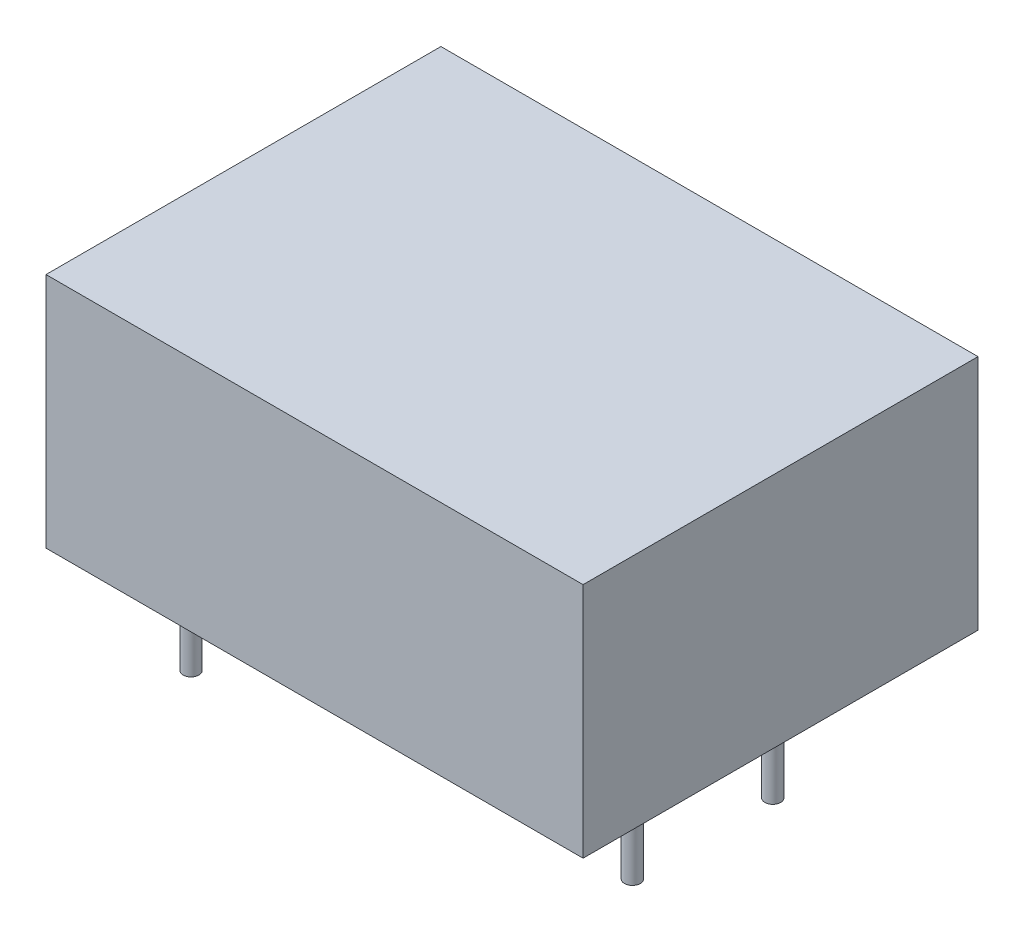
ISO-10303-21;
HEADER;
FILE_DESCRIPTION(('STEP AP214'),'2;1');
FILE_NAME('part.step','',(''),(''),'','','');
FILE_SCHEMA(('AUTOMOTIVE_DESIGN { 1 0 10303 214 1 1 1 1 }'));
ENDSEC;
DATA;
#1=APPLICATION_CONTEXT('core data for automotive mechanical design processes');
#2=APPLICATION_PROTOCOL_DEFINITION('international standard','automotive_design',2000,#1);
#3=PRODUCT_CONTEXT('',#1,'mechanical');
#4=PRODUCT('Part','Part','',(#3));
#5=PRODUCT_RELATED_PRODUCT_CATEGORY('part','',(#4));
#6=PRODUCT_DEFINITION_FORMATION('','',#4);
#7=PRODUCT_DEFINITION_CONTEXT('part definition',#1,'design');
#8=PRODUCT_DEFINITION('design','',#6,#7);
#9=PRODUCT_DEFINITION_SHAPE('','',#8);
#10=(LENGTH_UNIT() NAMED_UNIT(*) SI_UNIT(.MILLI.,.METRE.));
#11=(NAMED_UNIT(*) PLANE_ANGLE_UNIT() SI_UNIT($,.RADIAN.));
#12=(NAMED_UNIT(*) SI_UNIT($,.STERADIAN.) SOLID_ANGLE_UNIT());
#13=UNCERTAINTY_MEASURE_WITH_UNIT(LENGTH_MEASURE(1.E-05),#10,'distance_accuracy_value','');
#14=(GEOMETRIC_REPRESENTATION_CONTEXT(3) GLOBAL_UNCERTAINTY_ASSIGNED_CONTEXT((#13)) GLOBAL_UNIT_ASSIGNED_CONTEXT((#10,
#11,#12)) REPRESENTATION_CONTEXT('',''));
#15=CARTESIAN_POINT('',(0.,0.,0.));
#16=DIRECTION('',(0.,0.,1.));
#17=DIRECTION('',(1.,0.,0.));
#18=AXIS2_PLACEMENT_3D('',#15,#16,#17);
#19=CARTESIAN_POINT('',(17.,15.,12.5));
#20=DIRECTION('',(-1.,0.,0.));
#21=DIRECTION('',(0.,0.,1.));
#22=AXIS2_PLACEMENT_3D('',#19,#20,#21);
#23=PLANE('',#22);
#24=DIRECTION('',(0.,0.,-1.));
#25=VECTOR('',#24,1.);
#26=CARTESIAN_POINT('',(17.,0.,12.5));
#27=LINE('',#26,#25);
#28=CARTESIAN_POINT('',(17.,0.,12.5));
#29=VERTEX_POINT('',#28);
#30=CARTESIAN_POINT('',(17.,0.,-12.5));
#31=VERTEX_POINT('',#30);
#32=EDGE_CURVE('E117',#29,#31,#27,.T.);
#33=ORIENTED_EDGE('',*,*,#32,.T.);
#34=DIRECTION('',(0.,-1.,0.));
#35=VECTOR('',#34,1.);
#36=CARTESIAN_POINT('',(17.,15.,-12.5));
#37=LINE('',#36,#35);
#38=CARTESIAN_POINT('',(17.,15.,-12.5));
#39=VERTEX_POINT('',#38);
#40=EDGE_CURVE('E106',#39,#31,#37,.T.);
#41=ORIENTED_EDGE('',*,*,#40,.F.);
#42=DIRECTION('',(0.,0.,-1.));
#43=VECTOR('',#42,1.);
#44=CARTESIAN_POINT('',(17.,15.,12.5));
#45=LINE('',#44,#43);
#46=CARTESIAN_POINT('',(17.,15.,12.5));
#47=VERTEX_POINT('',#46);
#48=EDGE_CURVE('E98',#47,#39,#45,.T.);
#49=ORIENTED_EDGE('',*,*,#48,.F.);
#50=DIRECTION('',(0.,-1.,0.));
#51=VECTOR('',#50,1.);
#52=CARTESIAN_POINT('',(17.,15.,12.5));
#53=LINE('',#52,#51);
#54=EDGE_CURVE('E113',#47,#29,#53,.T.);
#55=ORIENTED_EDGE('',*,*,#54,.T.);
#56=EDGE_LOOP('',(#33,#41,#49,#55));
#57=FACE_BOUND('',#56,.T.);
#58=ADVANCED_FACE('F45',(#57),#23,.F.);
#59=CARTESIAN_POINT('',(-17.,15.,-12.5));
#60=DIRECTION('',(0.,0.,1.));
#61=DIRECTION('',(1.,0.,0.));
#62=AXIS2_PLACEMENT_3D('',#59,#60,#61);
#63=PLANE('',#62);
#64=DIRECTION('',(-1.,0.,0.));
#65=VECTOR('',#64,1.);
#66=CARTESIAN_POINT('',(-17.,0.,-12.5));
#67=LINE('',#66,#65);
#68=CARTESIAN_POINT('',(-17.,0.,-12.5));
#69=VERTEX_POINT('',#68);
#70=EDGE_CURVE('E104',#31,#69,#67,.T.);
#71=ORIENTED_EDGE('',*,*,#70,.T.);
#72=DIRECTION('',(0.,-1.,0.));
#73=VECTOR('',#72,1.);
#74=CARTESIAN_POINT('',(-17.,15.,-12.5));
#75=LINE('',#74,#73);
#76=CARTESIAN_POINT('',(-17.,15.,-12.5));
#77=VERTEX_POINT('',#76);
#78=EDGE_CURVE('E102',#77,#69,#75,.T.);
#79=ORIENTED_EDGE('',*,*,#78,.F.);
#80=DIRECTION('',(-1.,0.,0.));
#81=VECTOR('',#80,1.);
#82=CARTESIAN_POINT('',(-17.,15.,-12.5));
#83=LINE('',#82,#81);
#84=EDGE_CURVE('E93',#39,#77,#83,.T.);
#85=ORIENTED_EDGE('',*,*,#84,.F.);
#86=ORIENTED_EDGE('',*,*,#40,.T.);
#87=EDGE_LOOP('',(#71,#79,#85,#86));
#88=FACE_BOUND('',#87,.T.);
#89=ADVANCED_FACE('F103',(#88),#63,.F.);
#90=CARTESIAN_POINT('',(-17.,15.,12.5));
#91=DIRECTION('',(1.,0.,0.));
#92=DIRECTION('',(0.,0.,-1.));
#93=AXIS2_PLACEMENT_3D('',#90,#91,#92);
#94=PLANE('',#93);
#95=DIRECTION('',(0.,0.,1.));
#96=VECTOR('',#95,1.);
#97=CARTESIAN_POINT('',(-17.,0.,12.5));
#98=LINE('',#97,#96);
#99=CARTESIAN_POINT('',(-17.,0.,12.5));
#100=VERTEX_POINT('',#99);
#101=EDGE_CURVE('E79',#69,#100,#98,.T.);
#102=ORIENTED_EDGE('',*,*,#101,.T.);
#103=DIRECTION('',(0.,-1.,0.));
#104=VECTOR('',#103,1.);
#105=CARTESIAN_POINT('',(-17.,15.,12.5));
#106=LINE('',#105,#104);
#107=CARTESIAN_POINT('',(-17.,15.,12.5));
#108=VERTEX_POINT('',#107);
#109=EDGE_CURVE('E107',#108,#100,#106,.T.);
#110=ORIENTED_EDGE('',*,*,#109,.F.);
#111=DIRECTION('',(0.,0.,1.));
#112=VECTOR('',#111,1.);
#113=CARTESIAN_POINT('',(-17.,15.,12.5));
#114=LINE('',#113,#112);
#115=EDGE_CURVE('E96',#77,#108,#114,.T.);
#116=ORIENTED_EDGE('',*,*,#115,.F.);
#117=ORIENTED_EDGE('',*,*,#78,.T.);
#118=EDGE_LOOP('',(#102,#110,#116,#117));
#119=FACE_BOUND('',#118,.T.);
#120=ADVANCED_FACE('F109',(#119),#94,.F.);
#121=CARTESIAN_POINT('',(-17.,15.,12.5));
#122=DIRECTION('',(0.,0.,-1.));
#123=DIRECTION('',(-1.,0.,0.));
#124=AXIS2_PLACEMENT_3D('',#121,#122,#123);
#125=PLANE('',#124);
#126=DIRECTION('',(1.,0.,0.));
#127=VECTOR('',#126,1.);
#128=CARTESIAN_POINT('',(-17.,0.,12.5));
#129=LINE('',#128,#127);
#130=EDGE_CURVE('E85',#100,#29,#129,.T.);
#131=ORIENTED_EDGE('',*,*,#130,.T.);
#132=ORIENTED_EDGE('',*,*,#54,.F.);
#133=DIRECTION('',(1.,0.,0.));
#134=VECTOR('',#133,1.);
#135=CARTESIAN_POINT('',(-17.,15.,12.5));
#136=LINE('',#135,#134);
#137=EDGE_CURVE('E62',#108,#47,#136,.T.);
#138=ORIENTED_EDGE('',*,*,#137,.F.);
#139=ORIENTED_EDGE('',*,*,#109,.T.);
#140=EDGE_LOOP('',(#131,#132,#138,#139));
#141=FACE_BOUND('',#140,.T.);
#142=ADVANCED_FACE('F159',(#141),#125,.F.);
#143=CARTESIAN_POINT('',(0.,15.,0.));
#144=DIRECTION('',(0.,-1.,0.));
#145=DIRECTION('',(0.,0.,-1.));
#146=AXIS2_PLACEMENT_3D('',#143,#144,#145);
#147=PLANE('',#146);
#148=ORIENTED_EDGE('',*,*,#48,.T.);
#149=ORIENTED_EDGE('',*,*,#84,.T.);
#150=ORIENTED_EDGE('',*,*,#115,.T.);
#151=ORIENTED_EDGE('',*,*,#137,.T.);
#152=EDGE_LOOP('',(#148,#149,#150,#151));
#153=FACE_BOUND('',#152,.T.);
#154=ADVANCED_FACE('F94',(#153),#147,.F.);
#155=CARTESIAN_POINT('',(0.,0.,0.));
#156=DIRECTION('',(0.,-1.,0.));
#157=DIRECTION('',(0.,0.,-1.));
#158=AXIS2_PLACEMENT_3D('',#155,#156,#157);
#159=PLANE('',#158);
#160=CARTESIAN_POINT('',(-12.7,0.,-7.61999999999999));
#161=DIRECTION('',(0.,-1.,0.));
#162=DIRECTION('',(0.,0.,-1.));
#163=AXIS2_PLACEMENT_3D('',#160,#161,#162);
#164=CIRCLE('',#163,0.500000000000001);
#165=CARTESIAN_POINT('',(-12.7,0.,-8.12));
#166=VERTEX_POINT('',#165);
#167=EDGE_CURVE('E11',#166,#166,#164,.T.);
#168=ORIENTED_EDGE('',*,*,#167,.F.);
#169=EDGE_LOOP('',(#168));
#170=FACE_BOUND('',#169,.T.);
#171=CARTESIAN_POINT('',(12.7,0.,5.07999999999999));
#172=DIRECTION('',(0.,-1.,0.));
#173=DIRECTION('',(0.,0.,-1.));
#174=AXIS2_PLACEMENT_3D('',#171,#172,#173);
#175=CIRCLE('',#174,0.500000000000001);
#176=CARTESIAN_POINT('',(12.7,0.,4.57999999999999));
#177=VERTEX_POINT('',#176);
#178=EDGE_CURVE('E54',#177,#177,#175,.T.);
#179=ORIENTED_EDGE('',*,*,#178,.F.);
#180=EDGE_LOOP('',(#179));
#181=FACE_BOUND('',#180,.T.);
#182=CARTESIAN_POINT('',(12.7,0.,-3.81000000000001));
#183=DIRECTION('',(0.,-1.,0.));
#184=DIRECTION('',(0.,0.,-1.));
#185=AXIS2_PLACEMENT_3D('',#182,#183,#184);
#186=CIRCLE('',#185,0.500000000000001);
#187=CARTESIAN_POINT('',(12.7,0.,-4.31000000000001));
#188=VERTEX_POINT('',#187);
#189=EDGE_CURVE('E138',#188,#188,#186,.T.);
#190=ORIENTED_EDGE('',*,*,#189,.F.);
#191=EDGE_LOOP('',(#190));
#192=FACE_BOUND('',#191,.T.);
#193=CARTESIAN_POINT('',(-12.7,0.,7.62000000000001));
#194=DIRECTION('',(0.,-1.,0.));
#195=DIRECTION('',(0.,0.,-1.));
#196=AXIS2_PLACEMENT_3D('',#193,#194,#195);
#197=CIRCLE('',#196,0.500000000000001);
#198=CARTESIAN_POINT('',(-12.7,0.,7.12));
#199=VERTEX_POINT('',#198);
#200=EDGE_CURVE('E134',#199,#199,#197,.T.);
#201=ORIENTED_EDGE('',*,*,#200,.F.);
#202=EDGE_LOOP('',(#201));
#203=FACE_BOUND('',#202,.T.);
#204=ORIENTED_EDGE('',*,*,#32,.F.);
#205=ORIENTED_EDGE('',*,*,#130,.F.);
#206=ORIENTED_EDGE('',*,*,#101,.F.);
#207=ORIENTED_EDGE('',*,*,#70,.F.);
#208=EDGE_LOOP('',(#204,#205,#206,#207));
#209=FACE_BOUND('',#208,.T.);
#210=ADVANCED_FACE('F147',(#170,#181,#192,#203,#209),#159,.T.);
#211=CARTESIAN_POINT('',(-12.7,-7.,7.62000000000001));
#212=DIRECTION('',(0.,1.,0.));
#213=DIRECTION('',(0.,0.,1.));
#214=AXIS2_PLACEMENT_3D('',#211,#212,#213);
#215=CYLINDRICAL_SURFACE('',#214,0.500000000000001);
#216=CARTESIAN_POINT('',(-12.7,-7.,7.62000000000001));
#217=DIRECTION('',(0.,1.,0.));
#218=DIRECTION('',(0.,0.,1.));
#219=AXIS2_PLACEMENT_3D('',#216,#217,#218);
#220=CIRCLE('',#219,0.500000000000001);
#221=CARTESIAN_POINT('',(-12.7,-7.,8.12000000000001));
#222=VERTEX_POINT('',#221);
#223=EDGE_CURVE('E280',#222,#222,#220,.T.);
#224=ORIENTED_EDGE('',*,*,#223,.T.);
#225=EDGE_LOOP('',(#224));
#226=FACE_BOUND('',#225,.T.);
#227=ORIENTED_EDGE('',*,*,#200,.T.);
#228=EDGE_LOOP('',(#227));
#229=FACE_BOUND('',#228,.T.);
#230=ADVANCED_FACE('F150',(#226,#229),#215,.T.);
#231=CARTESIAN_POINT('',(-12.7,-7.,7.62000000000001));
#232=DIRECTION('',(0.,1.,0.));
#233=DIRECTION('',(0.,0.,1.));
#234=AXIS2_PLACEMENT_3D('',#231,#232,#233);
#235=PLANE('',#234);
#236=ORIENTED_EDGE('',*,*,#223,.F.);
#237=EDGE_LOOP('',(#236));
#238=FACE_BOUND('',#237,.T.);
#239=ADVANCED_FACE('F205',(#238),#235,.F.);
#240=CARTESIAN_POINT('',(12.7,-7.,-3.81000000000001));
#241=DIRECTION('',(0.,1.,0.));
#242=DIRECTION('',(0.,0.,1.));
#243=AXIS2_PLACEMENT_3D('',#240,#241,#242);
#244=CYLINDRICAL_SURFACE('',#243,0.500000000000001);
#245=CARTESIAN_POINT('',(12.7,-7.,-3.81000000000001));
#246=DIRECTION('',(0.,1.,0.));
#247=DIRECTION('',(0.,0.,1.));
#248=AXIS2_PLACEMENT_3D('',#245,#246,#247);
#249=CIRCLE('',#248,0.500000000000001);
#250=CARTESIAN_POINT('',(12.7,-7.,-3.31000000000001));
#251=VERTEX_POINT('',#250);
#252=EDGE_CURVE('E284',#251,#251,#249,.T.);
#253=ORIENTED_EDGE('',*,*,#252,.T.);
#254=EDGE_LOOP('',(#253));
#255=FACE_BOUND('',#254,.T.);
#256=ORIENTED_EDGE('',*,*,#189,.T.);
#257=EDGE_LOOP('',(#256));
#258=FACE_BOUND('',#257,.T.);
#259=ADVANCED_FACE('F215',(#255,#258),#244,.T.);
#260=CARTESIAN_POINT('',(12.7,-7.,-3.81000000000001));
#261=DIRECTION('',(0.,1.,0.));
#262=DIRECTION('',(0.,0.,1.));
#263=AXIS2_PLACEMENT_3D('',#260,#261,#262);
#264=PLANE('',#263);
#265=ORIENTED_EDGE('',*,*,#252,.F.);
#266=EDGE_LOOP('',(#265));
#267=FACE_BOUND('',#266,.T.);
#268=ADVANCED_FACE('F225',(#267),#264,.F.);
#269=CARTESIAN_POINT('',(12.7,-7.,5.07999999999999));
#270=DIRECTION('',(0.,1.,0.));
#271=DIRECTION('',(0.,0.,1.));
#272=AXIS2_PLACEMENT_3D('',#269,#270,#271);
#273=CYLINDRICAL_SURFACE('',#272,0.500000000000001);
#274=CARTESIAN_POINT('',(12.7,-7.,5.07999999999999));
#275=DIRECTION('',(0.,1.,0.));
#276=DIRECTION('',(0.,0.,1.));
#277=AXIS2_PLACEMENT_3D('',#274,#275,#276);
#278=CIRCLE('',#277,0.500000000000001);
#279=CARTESIAN_POINT('',(12.7,-7.,5.57999999999999));
#280=VERTEX_POINT('',#279);
#281=EDGE_CURVE('E287',#280,#280,#278,.T.);
#282=ORIENTED_EDGE('',*,*,#281,.T.);
#283=EDGE_LOOP('',(#282));
#284=FACE_BOUND('',#283,.T.);
#285=ORIENTED_EDGE('',*,*,#178,.T.);
#286=EDGE_LOOP('',(#285));
#287=FACE_BOUND('',#286,.T.);
#288=ADVANCED_FACE('F145',(#284,#287),#273,.T.);
#289=CARTESIAN_POINT('',(12.7,-7.,5.07999999999999));
#290=DIRECTION('',(0.,1.,0.));
#291=DIRECTION('',(0.,0.,1.));
#292=AXIS2_PLACEMENT_3D('',#289,#290,#291);
#293=PLANE('',#292);
#294=ORIENTED_EDGE('',*,*,#281,.F.);
#295=EDGE_LOOP('',(#294));
#296=FACE_BOUND('',#295,.T.);
#297=ADVANCED_FACE('F244',(#296),#293,.F.);
#298=CARTESIAN_POINT('',(-12.7,-7.,-7.61999999999999));
#299=DIRECTION('',(0.,1.,0.));
#300=DIRECTION('',(0.,0.,1.));
#301=AXIS2_PLACEMENT_3D('',#298,#299,#300);
#302=CYLINDRICAL_SURFACE('',#301,0.500000000000001);
#303=CARTESIAN_POINT('',(-12.7,-7.,-7.61999999999999));
#304=DIRECTION('',(0.,1.,0.));
#305=DIRECTION('',(0.,0.,1.));
#306=AXIS2_PLACEMENT_3D('',#303,#304,#305);
#307=CIRCLE('',#306,0.500000000000001);
#308=CARTESIAN_POINT('',(-12.7,-7.,-7.11999999999999));
#309=VERTEX_POINT('',#308);
#310=EDGE_CURVE('E121',#309,#309,#307,.T.);
#311=ORIENTED_EDGE('',*,*,#310,.T.);
#312=EDGE_LOOP('',(#311));
#313=FACE_BOUND('',#312,.T.);
#314=ORIENTED_EDGE('',*,*,#167,.T.);
#315=EDGE_LOOP('',(#314));
#316=FACE_BOUND('',#315,.T.);
#317=ADVANCED_FACE('F254',(#313,#316),#302,.T.);
#318=CARTESIAN_POINT('',(-12.7,-7.,-7.61999999999999));
#319=DIRECTION('',(0.,1.,0.));
#320=DIRECTION('',(0.,0.,1.));
#321=AXIS2_PLACEMENT_3D('',#318,#319,#320);
#322=PLANE('',#321);
#323=ORIENTED_EDGE('',*,*,#310,.F.);
#324=EDGE_LOOP('',(#323));
#325=FACE_BOUND('',#324,.T.);
#326=ADVANCED_FACE('F264',(#325),#322,.F.);
#327=CLOSED_SHELL('',(#58,#89,#120,#142,#154,#210,#230,#239,#259,#268,#288,#297,#317,#326));
#328=MANIFOLD_SOLID_BREP('B2',#327);
#329=ADVANCED_BREP_SHAPE_REPRESENTATION('',(#18,#328),#14);
#330=SHAPE_DEFINITION_REPRESENTATION(#9,#329);
ENDSEC;
END-ISO-10303-21;
